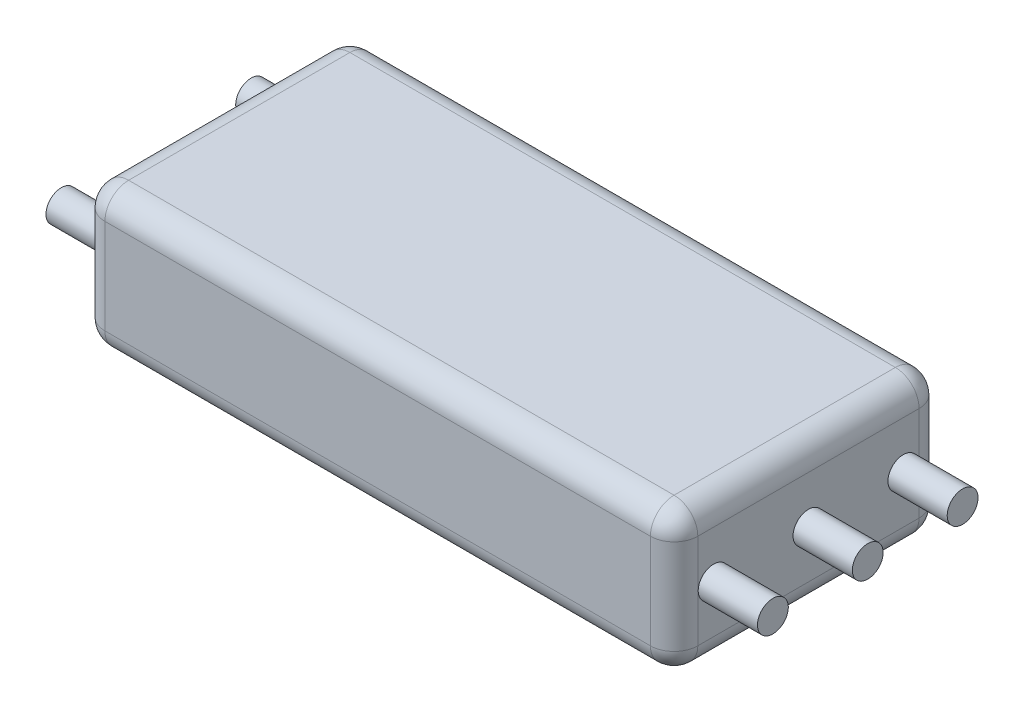
ISO-10303-21;
HEADER;
FILE_DESCRIPTION(('STEP AP214'),'2;1');
FILE_NAME('part.step','',(''),(''),'','','');
FILE_SCHEMA(('AUTOMOTIVE_DESIGN { 1 0 10303 214 1 1 1 1 }'));
ENDSEC;
DATA;
#1=APPLICATION_CONTEXT('core data for automotive mechanical design processes');
#2=APPLICATION_PROTOCOL_DEFINITION('international standard','automotive_design',2000,#1);
#3=PRODUCT_CONTEXT('',#1,'mechanical');
#4=PRODUCT('Part','Part','',(#3));
#5=PRODUCT_RELATED_PRODUCT_CATEGORY('part','',(#4));
#6=PRODUCT_DEFINITION_FORMATION('','',#4);
#7=PRODUCT_DEFINITION_CONTEXT('part definition',#1,'design');
#8=PRODUCT_DEFINITION('design','',#6,#7);
#9=PRODUCT_DEFINITION_SHAPE('','',#8);
#10=(LENGTH_UNIT() NAMED_UNIT(*) SI_UNIT(.MILLI.,.METRE.));
#11=(NAMED_UNIT(*) PLANE_ANGLE_UNIT() SI_UNIT($,.RADIAN.));
#12=(NAMED_UNIT(*) SI_UNIT($,.STERADIAN.) SOLID_ANGLE_UNIT());
#13=UNCERTAINTY_MEASURE_WITH_UNIT(LENGTH_MEASURE(1.E-05),#10,'distance_accuracy_value','');
#14=(GEOMETRIC_REPRESENTATION_CONTEXT(3) GLOBAL_UNCERTAINTY_ASSIGNED_CONTEXT((#13)) GLOBAL_UNIT_ASSIGNED_CONTEXT((#10,
#11,#12)) REPRESENTATION_CONTEXT('',''));
#15=CARTESIAN_POINT('',(0.,0.,0.));
#16=DIRECTION('',(0.,0.,1.));
#17=DIRECTION('',(1.,0.,0.));
#18=AXIS2_PLACEMENT_3D('',#15,#16,#17);
#19=CARTESIAN_POINT('',(31.75,7.62,14.3891));
#20=DIRECTION('',(-1.,0.,0.));
#21=DIRECTION('',(0.,0.,1.));
#22=AXIS2_PLACEMENT_3D('',#19,#20,#21);
#23=PLANE('',#22);
#24=CARTESIAN_POINT('',(31.75,0.,10.16));
#25=DIRECTION('',(-1.,0.,0.));
#26=DIRECTION('',(0.,0.,1.));
#27=AXIS2_PLACEMENT_3D('',#24,#25,#26);
#28=CIRCLE('',#27,1.651);
#29=CARTESIAN_POINT('',(31.75,0.,11.811));
#30=VERTEX_POINT('',#29);
#31=EDGE_CURVE('E805',#30,#30,#28,.T.);
#32=ORIENTED_EDGE('',*,*,#31,.T.);
#33=EDGE_LOOP('',(#32));
#34=FACE_BOUND('',#33,.T.);
#35=CARTESIAN_POINT('',(31.75,0.,-10.16));
#36=DIRECTION('',(-1.,0.,0.));
#37=DIRECTION('',(0.,0.,1.));
#38=AXIS2_PLACEMENT_3D('',#35,#36,#37);
#39=CIRCLE('',#38,1.651);
#40=CARTESIAN_POINT('',(31.75,0.,-8.509));
#41=VERTEX_POINT('',#40);
#42=EDGE_CURVE('E810',#41,#41,#39,.T.);
#43=ORIENTED_EDGE('',*,*,#42,.T.);
#44=EDGE_LOOP('',(#43));
#45=FACE_BOUND('',#44,.T.);
#46=CARTESIAN_POINT('',(31.75,0.,0.));
#47=DIRECTION('',(-1.,0.,0.));
#48=DIRECTION('',(0.,0.,1.));
#49=AXIS2_PLACEMENT_3D('',#46,#47,#48);
#50=CIRCLE('',#49,1.651);
#51=CARTESIAN_POINT('',(31.75,0.,1.651));
#52=VERTEX_POINT('',#51);
#53=EDGE_CURVE('E813',#52,#52,#50,.T.);
#54=ORIENTED_EDGE('',*,*,#53,.T.);
#55=EDGE_LOOP('',(#54));
#56=FACE_BOUND('',#55,.T.);
#57=DIRECTION('',(0.,-1.,0.));
#58=VECTOR('',#57,1.);
#59=CARTESIAN_POINT('',(31.75,7.62,-11.8491));
#60=LINE('',#59,#58);
#61=CARTESIAN_POINT('',(31.75,-5.08,-11.8491));
#62=VERTEX_POINT('',#61);
#63=CARTESIAN_POINT('',(31.75,5.08,-11.8491));
#64=VERTEX_POINT('',#63);
#65=EDGE_CURVE('E138',#62,#64,#60,.F.);
#66=ORIENTED_EDGE('',*,*,#65,.T.);
#67=DIRECTION('',(0.,0.,-1.));
#68=VECTOR('',#67,1.);
#69=CARTESIAN_POINT('',(31.75,5.08,14.3891));
#70=LINE('',#69,#68);
#71=CARTESIAN_POINT('',(31.75,5.08,11.8491));
#72=VERTEX_POINT('',#71);
#73=EDGE_CURVE('E176',#64,#72,#70,.F.);
#74=ORIENTED_EDGE('',*,*,#73,.T.);
#75=DIRECTION('',(0.,-1.,0.));
#76=VECTOR('',#75,1.);
#77=CARTESIAN_POINT('',(31.75,7.62,11.8491));
#78=LINE('',#77,#76);
#79=CARTESIAN_POINT('',(31.75,-5.08,11.8491));
#80=VERTEX_POINT('',#79);
#81=EDGE_CURVE('E173',#72,#80,#78,.T.);
#82=ORIENTED_EDGE('',*,*,#81,.T.);
#83=DIRECTION('',(0.,0.,-1.));
#84=VECTOR('',#83,1.);
#85=CARTESIAN_POINT('',(31.75,-5.08,-14.3891));
#86=LINE('',#85,#84);
#87=EDGE_CURVE('E168',#80,#62,#86,.T.);
#88=ORIENTED_EDGE('',*,*,#87,.T.);
#89=EDGE_LOOP('',(#66,#74,#82,#88));
#90=FACE_BOUND('',#89,.T.);
#91=ADVANCED_FACE('F42',(#34,#45,#56,#90),#23,.F.);
#92=CARTESIAN_POINT('',(-31.75,7.62,-14.3891));
#93=DIRECTION('',(0.,0.,1.));
#94=DIRECTION('',(1.,0.,0.));
#95=AXIS2_PLACEMENT_3D('',#92,#93,#94);
#96=PLANE('',#95);
#97=DIRECTION('',(0.,-1.,0.));
#98=VECTOR('',#97,1.);
#99=CARTESIAN_POINT('',(-29.21,7.62,-14.3891));
#100=LINE('',#99,#98);
#101=CARTESIAN_POINT('',(-29.21,-5.08,-14.3891));
#102=VERTEX_POINT('',#101);
#103=CARTESIAN_POINT('',(-29.21,5.08,-14.3891));
#104=VERTEX_POINT('',#103);
#105=EDGE_CURVE('E161',#102,#104,#100,.F.);
#106=ORIENTED_EDGE('',*,*,#105,.T.);
#107=DIRECTION('',(-1.,0.,0.));
#108=VECTOR('',#107,1.);
#109=CARTESIAN_POINT('',(-31.75,5.08,-14.3891));
#110=LINE('',#109,#108);
#111=CARTESIAN_POINT('',(29.21,5.08,-14.3891));
#112=VERTEX_POINT('',#111);
#113=EDGE_CURVE('E165',#104,#112,#110,.F.);
#114=ORIENTED_EDGE('',*,*,#113,.T.);
#115=DIRECTION('',(0.,-1.,0.));
#116=VECTOR('',#115,1.);
#117=CARTESIAN_POINT('',(29.21,7.62,-14.3891));
#118=LINE('',#117,#116);
#119=CARTESIAN_POINT('',(29.21,-5.08,-14.3891));
#120=VERTEX_POINT('',#119);
#121=EDGE_CURVE('E136',#112,#120,#118,.T.);
#122=ORIENTED_EDGE('',*,*,#121,.T.);
#123=DIRECTION('',(-1.,0.,0.));
#124=VECTOR('',#123,1.);
#125=CARTESIAN_POINT('',(-31.75,-5.08,-14.3891));
#126=LINE('',#125,#124);
#127=EDGE_CURVE('E155',#120,#102,#126,.T.);
#128=ORIENTED_EDGE('',*,*,#127,.T.);
#129=EDGE_LOOP('',(#106,#114,#122,#128));
#130=FACE_BOUND('',#129,.T.);
#131=ADVANCED_FACE('F163',(#130),#96,.F.);
#132=CARTESIAN_POINT('',(-31.75,7.62,14.3891));
#133=DIRECTION('',(1.,0.,0.));
#134=DIRECTION('',(0.,0.,-1.));
#135=AXIS2_PLACEMENT_3D('',#132,#133,#134);
#136=PLANE('',#135);
#137=CARTESIAN_POINT('',(-31.75,0.,10.16));
#138=DIRECTION('',(1.,0.,0.));
#139=DIRECTION('',(0.,0.,-1.));
#140=AXIS2_PLACEMENT_3D('',#137,#138,#139);
#141=CIRCLE('',#140,1.651);
#142=CARTESIAN_POINT('',(-31.75,0.,8.509));
#143=VERTEX_POINT('',#142);
#144=EDGE_CURVE('E791',#143,#143,#141,.T.);
#145=ORIENTED_EDGE('',*,*,#144,.T.);
#146=EDGE_LOOP('',(#145));
#147=FACE_BOUND('',#146,.T.);
#148=CARTESIAN_POINT('',(-31.75,0.,-10.16));
#149=DIRECTION('',(1.,0.,0.));
#150=DIRECTION('',(0.,0.,-1.));
#151=AXIS2_PLACEMENT_3D('',#148,#149,#150);
#152=CIRCLE('',#151,1.651);
#153=CARTESIAN_POINT('',(-31.75,0.,-11.811));
#154=VERTEX_POINT('',#153);
#155=EDGE_CURVE('E794',#154,#154,#152,.T.);
#156=ORIENTED_EDGE('',*,*,#155,.T.);
#157=EDGE_LOOP('',(#156));
#158=FACE_BOUND('',#157,.T.);
#159=DIRECTION('',(0.,-1.,0.));
#160=VECTOR('',#159,1.);
#161=CARTESIAN_POINT('',(-31.75,7.62,11.8491));
#162=LINE('',#161,#160);
#163=CARTESIAN_POINT('',(-31.75,-5.08,11.8491));
#164=VERTEX_POINT('',#163);
#165=CARTESIAN_POINT('',(-31.75,5.08,11.8491));
#166=VERTEX_POINT('',#165);
#167=EDGE_CURVE('E180',#164,#166,#162,.F.);
#168=ORIENTED_EDGE('',*,*,#167,.T.);
#169=DIRECTION('',(0.,0.,1.));
#170=VECTOR('',#169,1.);
#171=CARTESIAN_POINT('',(-31.75,5.08,14.3891));
#172=LINE('',#171,#170);
#173=CARTESIAN_POINT('',(-31.75,5.08,-11.8491));
#174=VERTEX_POINT('',#173);
#175=EDGE_CURVE('E185',#166,#174,#172,.F.);
#176=ORIENTED_EDGE('',*,*,#175,.T.);
#177=DIRECTION('',(0.,-1.,0.));
#178=VECTOR('',#177,1.);
#179=CARTESIAN_POINT('',(-31.75,7.62,-11.8491));
#180=LINE('',#179,#178);
#181=CARTESIAN_POINT('',(-31.75,-5.08,-11.8491));
#182=VERTEX_POINT('',#181);
#183=EDGE_CURVE('E182',#174,#182,#180,.T.);
#184=ORIENTED_EDGE('',*,*,#183,.T.);
#185=DIRECTION('',(0.,0.,1.));
#186=VECTOR('',#185,1.);
#187=CARTESIAN_POINT('',(-31.75,-5.08,14.3891));
#188=LINE('',#187,#186);
#189=EDGE_CURVE('E178',#182,#164,#188,.T.);
#190=ORIENTED_EDGE('',*,*,#189,.T.);
#191=EDGE_LOOP('',(#168,#176,#184,#190));
#192=FACE_BOUND('',#191,.T.);
#193=ADVANCED_FACE('F290',(#147,#158,#192),#136,.F.);
#194=CARTESIAN_POINT('',(-31.75,7.62,14.3891));
#195=DIRECTION('',(0.,0.,-1.));
#196=DIRECTION('',(-1.,0.,0.));
#197=AXIS2_PLACEMENT_3D('',#194,#195,#196);
#198=PLANE('',#197);
#199=DIRECTION('',(0.,-1.,0.));
#200=VECTOR('',#199,1.);
#201=CARTESIAN_POINT('',(29.21,7.62,14.3891));
#202=LINE('',#201,#200);
#203=CARTESIAN_POINT('',(29.21,-5.08,14.3891));
#204=VERTEX_POINT('',#203);
#205=CARTESIAN_POINT('',(29.21,5.08,14.3891));
#206=VERTEX_POINT('',#205);
#207=EDGE_CURVE('E189',#204,#206,#202,.F.);
#208=ORIENTED_EDGE('',*,*,#207,.T.);
#209=DIRECTION('',(1.,0.,0.));
#210=VECTOR('',#209,1.);
#211=CARTESIAN_POINT('',(-31.75,5.08,14.3891));
#212=LINE('',#211,#210);
#213=CARTESIAN_POINT('',(-29.21,5.08,14.3891));
#214=VERTEX_POINT('',#213);
#215=EDGE_CURVE('E194',#206,#214,#212,.F.);
#216=ORIENTED_EDGE('',*,*,#215,.T.);
#217=DIRECTION('',(0.,-1.,0.));
#218=VECTOR('',#217,1.);
#219=CARTESIAN_POINT('',(-29.21,7.62,14.3891));
#220=LINE('',#219,#218);
#221=CARTESIAN_POINT('',(-29.21,-5.08,14.3891));
#222=VERTEX_POINT('',#221);
#223=EDGE_CURVE('E191',#214,#222,#220,.T.);
#224=ORIENTED_EDGE('',*,*,#223,.T.);
#225=DIRECTION('',(1.,0.,0.));
#226=VECTOR('',#225,1.);
#227=CARTESIAN_POINT('',(31.75,-5.08,14.3891));
#228=LINE('',#227,#226);
#229=EDGE_CURVE('E187',#222,#204,#228,.T.);
#230=ORIENTED_EDGE('',*,*,#229,.T.);
#231=EDGE_LOOP('',(#208,#216,#224,#230));
#232=FACE_BOUND('',#231,.T.);
#233=ADVANCED_FACE('F301',(#232),#198,.F.);
#234=CARTESIAN_POINT('',(0.,7.62,0.));
#235=DIRECTION('',(0.,-1.,0.));
#236=DIRECTION('',(0.,0.,-1.));
#237=AXIS2_PLACEMENT_3D('',#234,#235,#236);
#238=PLANE('',#237);
#239=DIRECTION('',(0.,0.,1.));
#240=VECTOR('',#239,1.);
#241=CARTESIAN_POINT('',(-29.21,7.62,0.));
#242=LINE('',#241,#240);
#243=CARTESIAN_POINT('',(-29.21,7.62,-11.8491));
#244=VERTEX_POINT('',#243);
#245=CARTESIAN_POINT('',(-29.21,7.62,11.8491));
#246=VERTEX_POINT('',#245);
#247=EDGE_CURVE('E200',#244,#246,#242,.T.);
#248=ORIENTED_EDGE('',*,*,#247,.T.);
#249=DIRECTION('',(1.,0.,0.));
#250=VECTOR('',#249,1.);
#251=CARTESIAN_POINT('',(0.,7.62,11.8491));
#252=LINE('',#251,#250);
#253=CARTESIAN_POINT('',(29.21,7.62,11.8491));
#254=VERTEX_POINT('',#253);
#255=EDGE_CURVE('E202',#246,#254,#252,.T.);
#256=ORIENTED_EDGE('',*,*,#255,.T.);
#257=DIRECTION('',(0.,0.,-1.));
#258=VECTOR('',#257,1.);
#259=CARTESIAN_POINT('',(29.21,7.62,0.));
#260=LINE('',#259,#258);
#261=CARTESIAN_POINT('',(29.21,7.62,-11.8491));
#262=VERTEX_POINT('',#261);
#263=EDGE_CURVE('E196',#254,#262,#260,.T.);
#264=ORIENTED_EDGE('',*,*,#263,.T.);
#265=DIRECTION('',(-1.,0.,0.));
#266=VECTOR('',#265,1.);
#267=CARTESIAN_POINT('',(0.,7.62,-11.8491));
#268=LINE('',#267,#266);
#269=EDGE_CURVE('E198',#262,#244,#268,.T.);
#270=ORIENTED_EDGE('',*,*,#269,.T.);
#271=EDGE_LOOP('',(#248,#256,#264,#270));
#272=FACE_BOUND('',#271,.T.);
#273=ADVANCED_FACE('F282',(#272),#238,.F.);
#274=CARTESIAN_POINT('',(0.,-7.62,0.));
#275=DIRECTION('',(0.,-1.,0.));
#276=DIRECTION('',(0.,0.,-1.));
#277=AXIS2_PLACEMENT_3D('',#274,#275,#276);
#278=PLANE('',#277);
#279=DIRECTION('',(0.,0.,1.));
#280=VECTOR('',#279,1.);
#281=CARTESIAN_POINT('',(-29.21,-7.62,-14.3891));
#282=LINE('',#281,#280);
#283=CARTESIAN_POINT('',(-29.21,-7.62,11.8491));
#284=VERTEX_POINT('',#283);
#285=CARTESIAN_POINT('',(-29.21,-7.62,-11.8491));
#286=VERTEX_POINT('',#285);
#287=EDGE_CURVE('E51',#284,#286,#282,.F.);
#288=ORIENTED_EDGE('',*,*,#287,.T.);
#289=DIRECTION('',(-1.,0.,0.));
#290=VECTOR('',#289,1.);
#291=CARTESIAN_POINT('',(31.75,-7.62,-11.8491));
#292=LINE('',#291,#290);
#293=CARTESIAN_POINT('',(29.21,-7.62,-11.8491));
#294=VERTEX_POINT('',#293);
#295=EDGE_CURVE('E11',#286,#294,#292,.F.);
#296=ORIENTED_EDGE('',*,*,#295,.T.);
#297=DIRECTION('',(0.,0.,-1.));
#298=VECTOR('',#297,1.);
#299=CARTESIAN_POINT('',(29.21,-7.62,14.3891));
#300=LINE('',#299,#298);
#301=CARTESIAN_POINT('',(29.21,-7.62,11.8491));
#302=VERTEX_POINT('',#301);
#303=EDGE_CURVE('E205',#294,#302,#300,.F.);
#304=ORIENTED_EDGE('',*,*,#303,.T.);
#305=DIRECTION('',(1.,0.,0.));
#306=VECTOR('',#305,1.);
#307=CARTESIAN_POINT('',(-31.75,-7.62,11.8491));
#308=LINE('',#307,#306);
#309=EDGE_CURVE('E62',#302,#284,#308,.F.);
#310=ORIENTED_EDGE('',*,*,#309,.T.);
#311=EDGE_LOOP('',(#288,#296,#304,#310));
#312=FACE_BOUND('',#311,.T.);
#313=ADVANCED_FACE('F695',(#312),#278,.T.);
#314=CARTESIAN_POINT('',(-29.21,7.62,11.8491));
#315=DIRECTION('',(0.,-1.,0.));
#316=DIRECTION('',(0.,0.,-1.));
#317=AXIS2_PLACEMENT_3D('',#314,#315,#316);
#318=CYLINDRICAL_SURFACE('',#317,2.54);
#319=CARTESIAN_POINT('',(-29.21,5.08,11.8491));
#320=DIRECTION('',(0.,1.,0.));
#321=DIRECTION('',(0.,0.,1.));
#322=AXIS2_PLACEMENT_3D('',#319,#320,#321);
#323=CIRCLE('',#322,2.54);
#324=EDGE_CURVE('E46',#166,#214,#323,.T.);
#325=ORIENTED_EDGE('',*,*,#324,.F.);
#326=ORIENTED_EDGE('',*,*,#167,.F.);
#327=CARTESIAN_POINT('',(-29.21,-5.08,11.8491));
#328=DIRECTION('',(0.,-1.,0.));
#329=DIRECTION('',(0.,0.,-1.));
#330=AXIS2_PLACEMENT_3D('',#327,#328,#329);
#331=CIRCLE('',#330,2.54);
#332=EDGE_CURVE('E259',#222,#164,#331,.T.);
#333=ORIENTED_EDGE('',*,*,#332,.F.);
#334=ORIENTED_EDGE('',*,*,#223,.F.);
#335=EDGE_LOOP('',(#325,#326,#333,#334));
#336=FACE_BOUND('',#335,.T.);
#337=ADVANCED_FACE('F44',(#336),#318,.T.);
#338=CARTESIAN_POINT('',(-29.21,5.08,11.8491));
#339=DIRECTION('',(0.,0.,1.));
#340=DIRECTION('',(1.,0.,0.));
#341=AXIS2_PLACEMENT_3D('',#338,#339,#340);
#342=SPHERICAL_SURFACE('',#341,2.54);
#343=CARTESIAN_POINT('',(-29.21,5.08,11.8491));
#344=DIRECTION('',(0.,0.,1.));
#345=DIRECTION('',(1.,0.,0.));
#346=AXIS2_PLACEMENT_3D('',#343,#344,#345);
#347=CIRCLE('',#346,2.54);
#348=EDGE_CURVE('E254',#166,#246,#347,.F.);
#349=ORIENTED_EDGE('',*,*,#348,.F.);
#350=ORIENTED_EDGE('',*,*,#324,.T.);
#351=CARTESIAN_POINT('',(-29.21,5.08,11.8491));
#352=DIRECTION('',(-1.,0.,0.));
#353=DIRECTION('',(0.,0.,1.));
#354=AXIS2_PLACEMENT_3D('',#351,#352,#353);
#355=CIRCLE('',#354,2.54);
#356=EDGE_CURVE('E257',#246,#214,#355,.F.);
#357=ORIENTED_EDGE('',*,*,#356,.F.);
#358=EDGE_LOOP('',(#349,#350,#357));
#359=FACE_BOUND('',#358,.T.);
#360=ADVANCED_FACE('F270',(#359),#342,.T.);
#361=CARTESIAN_POINT('',(-29.21,-5.08,11.8491));
#362=DIRECTION('',(-1.,0.,0.));
#363=DIRECTION('',(0.,-1.,0.));
#364=AXIS2_PLACEMENT_3D('',#361,#362,#363);
#365=SPHERICAL_SURFACE('',#364,2.54);
#366=CARTESIAN_POINT('',(-29.21,-5.08,11.8491));
#367=DIRECTION('',(-1.,0.,0.));
#368=DIRECTION('',(0.,0.,1.));
#369=AXIS2_PLACEMENT_3D('',#366,#367,#368);
#370=CIRCLE('',#369,2.54);
#371=EDGE_CURVE('E249',#222,#284,#370,.F.);
#372=ORIENTED_EDGE('',*,*,#371,.F.);
#373=ORIENTED_EDGE('',*,*,#332,.T.);
#374=CARTESIAN_POINT('',(-29.21,-5.08,11.8491));
#375=DIRECTION('',(0.,0.,1.));
#376=DIRECTION('',(1.,0.,0.));
#377=AXIS2_PLACEMENT_3D('',#374,#375,#376);
#378=CIRCLE('',#377,2.54);
#379=EDGE_CURVE('E251',#284,#164,#378,.F.);
#380=ORIENTED_EDGE('',*,*,#379,.F.);
#381=EDGE_LOOP('',(#372,#373,#380));
#382=FACE_BOUND('',#381,.T.);
#383=ADVANCED_FACE('F665',(#382),#365,.T.);
#384=CARTESIAN_POINT('',(0.,5.08,11.8491));
#385=DIRECTION('',(1.,0.,0.));
#386=DIRECTION('',(0.,0.,-1.));
#387=AXIS2_PLACEMENT_3D('',#384,#385,#386);
#388=CYLINDRICAL_SURFACE('',#387,2.54);
#389=ORIENTED_EDGE('',*,*,#356,.T.);
#390=ORIENTED_EDGE('',*,*,#215,.F.);
#391=CARTESIAN_POINT('',(29.21,5.08,11.8491));
#392=DIRECTION('',(1.,0.,0.));
#393=DIRECTION('',(0.,0.,-1.));
#394=AXIS2_PLACEMENT_3D('',#391,#392,#393);
#395=CIRCLE('',#394,2.54);
#396=EDGE_CURVE('E243',#254,#206,#395,.T.);
#397=ORIENTED_EDGE('',*,*,#396,.F.);
#398=ORIENTED_EDGE('',*,*,#255,.F.);
#399=EDGE_LOOP('',(#389,#390,#397,#398));
#400=FACE_BOUND('',#399,.T.);
#401=ADVANCED_FACE('F278',(#400),#388,.T.);
#402=CARTESIAN_POINT('',(-29.21,5.08,0.));
#403=DIRECTION('',(0.,0.,1.));
#404=DIRECTION('',(1.,0.,0.));
#405=AXIS2_PLACEMENT_3D('',#402,#403,#404);
#406=CYLINDRICAL_SURFACE('',#405,2.54);
#407=ORIENTED_EDGE('',*,*,#348,.T.);
#408=ORIENTED_EDGE('',*,*,#247,.F.);
#409=CARTESIAN_POINT('',(-29.21,5.08,-11.8491));
#410=DIRECTION('',(0.,0.,-1.));
#411=DIRECTION('',(-1.,0.,0.));
#412=AXIS2_PLACEMENT_3D('',#409,#410,#411);
#413=CIRCLE('',#412,2.54);
#414=EDGE_CURVE('E240',#174,#244,#413,.T.);
#415=ORIENTED_EDGE('',*,*,#414,.F.);
#416=ORIENTED_EDGE('',*,*,#175,.F.);
#417=EDGE_LOOP('',(#407,#408,#415,#416));
#418=FACE_BOUND('',#417,.T.);
#419=ADVANCED_FACE('F287',(#418),#406,.T.);
#420=CARTESIAN_POINT('',(-29.21,7.62,-11.8491));
#421=DIRECTION('',(0.,-1.,0.));
#422=DIRECTION('',(0.,0.,-1.));
#423=AXIS2_PLACEMENT_3D('',#420,#421,#422);
#424=CYLINDRICAL_SURFACE('',#423,2.54);
#425=CARTESIAN_POINT('',(-29.21,-5.08,-11.8491));
#426=DIRECTION('',(0.,-1.,0.));
#427=DIRECTION('',(0.,0.,-1.));
#428=AXIS2_PLACEMENT_3D('',#425,#426,#427);
#429=CIRCLE('',#428,2.54);
#430=EDGE_CURVE('E234',#182,#102,#429,.T.);
#431=ORIENTED_EDGE('',*,*,#430,.F.);
#432=ORIENTED_EDGE('',*,*,#183,.F.);
#433=CARTESIAN_POINT('',(-29.21,5.08,-11.8491));
#434=DIRECTION('',(0.,1.,0.));
#435=DIRECTION('',(0.,0.,1.));
#436=AXIS2_PLACEMENT_3D('',#433,#434,#435);
#437=CIRCLE('',#436,2.54);
#438=EDGE_CURVE('E237',#104,#174,#437,.T.);
#439=ORIENTED_EDGE('',*,*,#438,.F.);
#440=ORIENTED_EDGE('',*,*,#105,.F.);
#441=EDGE_LOOP('',(#431,#432,#439,#440));
#442=FACE_BOUND('',#441,.T.);
#443=ADVANCED_FACE('F294',(#442),#424,.T.);
#444=CARTESIAN_POINT('',(-29.21,-5.08,14.3891));
#445=DIRECTION('',(0.,0.,-1.));
#446=DIRECTION('',(-1.,0.,0.));
#447=AXIS2_PLACEMENT_3D('',#444,#445,#446);
#448=CYLINDRICAL_SURFACE('',#447,2.54);
#449=ORIENTED_EDGE('',*,*,#379,.T.);
#450=ORIENTED_EDGE('',*,*,#189,.F.);
#451=CARTESIAN_POINT('',(-29.21,-5.08,-11.8491));
#452=DIRECTION('',(0.,0.,-1.));
#453=DIRECTION('',(-1.,0.,0.));
#454=AXIS2_PLACEMENT_3D('',#451,#452,#453);
#455=CIRCLE('',#454,2.54);
#456=EDGE_CURVE('E232',#286,#182,#455,.T.);
#457=ORIENTED_EDGE('',*,*,#456,.F.);
#458=ORIENTED_EDGE('',*,*,#287,.F.);
#459=EDGE_LOOP('',(#449,#450,#457,#458));
#460=FACE_BOUND('',#459,.T.);
#461=ADVANCED_FACE('F299',(#460),#448,.T.);
#462=CARTESIAN_POINT('',(-31.75,-5.08,11.8491));
#463=DIRECTION('',(-1.,0.,0.));
#464=DIRECTION('',(0.,0.,1.));
#465=AXIS2_PLACEMENT_3D('',#462,#463,#464);
#466=CYLINDRICAL_SURFACE('',#465,2.54);
#467=ORIENTED_EDGE('',*,*,#371,.T.);
#468=ORIENTED_EDGE('',*,*,#309,.F.);
#469=CARTESIAN_POINT('',(29.21,-5.08,11.8491));
#470=DIRECTION('',(1.,0.,0.));
#471=DIRECTION('',(0.,0.,-1.));
#472=AXIS2_PLACEMENT_3D('',#469,#470,#471);
#473=CIRCLE('',#472,2.54);
#474=EDGE_CURVE('E229',#204,#302,#473,.T.);
#475=ORIENTED_EDGE('',*,*,#474,.F.);
#476=ORIENTED_EDGE('',*,*,#229,.F.);
#477=EDGE_LOOP('',(#467,#468,#475,#476));
#478=FACE_BOUND('',#477,.T.);
#479=ADVANCED_FACE('F310',(#478),#466,.T.);
#480=CARTESIAN_POINT('',(29.21,7.62,11.8491));
#481=DIRECTION('',(0.,-1.,0.));
#482=DIRECTION('',(0.,0.,-1.));
#483=AXIS2_PLACEMENT_3D('',#480,#481,#482);
#484=CYLINDRICAL_SURFACE('',#483,2.54);
#485=CARTESIAN_POINT('',(29.21,5.08,11.8491));
#486=DIRECTION('',(0.,1.,0.));
#487=DIRECTION('',(0.,0.,1.));
#488=AXIS2_PLACEMENT_3D('',#485,#486,#487);
#489=CIRCLE('',#488,2.54);
#490=EDGE_CURVE('E246',#206,#72,#489,.T.);
#491=ORIENTED_EDGE('',*,*,#490,.F.);
#492=ORIENTED_EDGE('',*,*,#207,.F.);
#493=CARTESIAN_POINT('',(29.21,-5.08,11.8491));
#494=DIRECTION('',(0.,-1.,0.));
#495=DIRECTION('',(0.,0.,-1.));
#496=AXIS2_PLACEMENT_3D('',#493,#494,#495);
#497=CIRCLE('',#496,2.54);
#498=EDGE_CURVE('E226',#80,#204,#497,.T.);
#499=ORIENTED_EDGE('',*,*,#498,.F.);
#500=ORIENTED_EDGE('',*,*,#81,.F.);
#501=EDGE_LOOP('',(#491,#492,#499,#500));
#502=FACE_BOUND('',#501,.T.);
#503=ADVANCED_FACE('F306',(#502),#484,.T.);
#504=CARTESIAN_POINT('',(29.21,5.08,11.8491));
#505=DIRECTION('',(0.,0.,1.));
#506=DIRECTION('',(1.,0.,0.));
#507=AXIS2_PLACEMENT_3D('',#504,#505,#506);
#508=SPHERICAL_SURFACE('',#507,2.54);
#509=ORIENTED_EDGE('',*,*,#396,.T.);
#510=ORIENTED_EDGE('',*,*,#490,.T.);
#511=CARTESIAN_POINT('',(29.21,5.08,11.8491));
#512=DIRECTION('',(0.,0.,1.));
#513=DIRECTION('',(1.,0.,0.));
#514=AXIS2_PLACEMENT_3D('',#511,#512,#513);
#515=CIRCLE('',#514,2.54);
#516=EDGE_CURVE('E223',#254,#72,#515,.F.);
#517=ORIENTED_EDGE('',*,*,#516,.F.);
#518=EDGE_LOOP('',(#509,#510,#517));
#519=FACE_BOUND('',#518,.T.);
#520=ADVANCED_FACE('F320',(#519),#508,.T.);
#521=CARTESIAN_POINT('',(-29.21,5.08,-11.8491));
#522=DIRECTION('',(-1.,0.,0.));
#523=DIRECTION('',(0.,0.,1.));
#524=AXIS2_PLACEMENT_3D('',#521,#522,#523);
#525=SPHERICAL_SURFACE('',#524,2.54);
#526=ORIENTED_EDGE('',*,*,#438,.T.);
#527=ORIENTED_EDGE('',*,*,#414,.T.);
#528=CARTESIAN_POINT('',(-29.21,5.08,-11.8491));
#529=DIRECTION('',(-1.,0.,0.));
#530=DIRECTION('',(0.,0.,1.));
#531=AXIS2_PLACEMENT_3D('',#528,#529,#530);
#532=CIRCLE('',#531,2.54);
#533=EDGE_CURVE('E220',#104,#244,#532,.F.);
#534=ORIENTED_EDGE('',*,*,#533,.F.);
#535=EDGE_LOOP('',(#526,#527,#534));
#536=FACE_BOUND('',#535,.T.);
#537=ADVANCED_FACE('F330',(#536),#525,.T.);
#538=CARTESIAN_POINT('',(-29.21,-5.08,-11.8491));
#539=DIRECTION('',(-1.,0.,0.));
#540=DIRECTION('',(0.,-1.,0.));
#541=AXIS2_PLACEMENT_3D('',#538,#539,#540);
#542=SPHERICAL_SURFACE('',#541,2.54);
#543=ORIENTED_EDGE('',*,*,#456,.T.);
#544=ORIENTED_EDGE('',*,*,#430,.T.);
#545=CARTESIAN_POINT('',(-29.21,-5.08,-11.8491));
#546=DIRECTION('',(-1.,0.,0.));
#547=DIRECTION('',(0.,0.,1.));
#548=AXIS2_PLACEMENT_3D('',#545,#546,#547);
#549=CIRCLE('',#548,2.54);
#550=EDGE_CURVE('E158',#286,#102,#549,.F.);
#551=ORIENTED_EDGE('',*,*,#550,.F.);
#552=EDGE_LOOP('',(#543,#544,#551));
#553=FACE_BOUND('',#552,.T.);
#554=ADVANCED_FACE('F332',(#553),#542,.T.);
#555=CARTESIAN_POINT('',(29.21,-5.08,11.8491));
#556=DIRECTION('',(0.,0.,1.));
#557=DIRECTION('',(0.,-1.,0.));
#558=AXIS2_PLACEMENT_3D('',#555,#556,#557);
#559=SPHERICAL_SURFACE('',#558,2.54);
#560=ORIENTED_EDGE('',*,*,#498,.T.);
#561=ORIENTED_EDGE('',*,*,#474,.T.);
#562=CARTESIAN_POINT('',(29.21,-5.08,11.8491));
#563=DIRECTION('',(0.,0.,1.));
#564=DIRECTION('',(1.,0.,0.));
#565=AXIS2_PLACEMENT_3D('',#562,#563,#564);
#566=CIRCLE('',#565,2.54);
#567=EDGE_CURVE('E216',#80,#302,#566,.F.);
#568=ORIENTED_EDGE('',*,*,#567,.F.);
#569=EDGE_LOOP('',(#560,#561,#568));
#570=FACE_BOUND('',#569,.T.);
#571=ADVANCED_FACE('F312',(#570),#559,.T.);
#572=CARTESIAN_POINT('',(29.21,5.08,0.));
#573=DIRECTION('',(0.,0.,-1.));
#574=DIRECTION('',(-1.,0.,0.));
#575=AXIS2_PLACEMENT_3D('',#572,#573,#574);
#576=CYLINDRICAL_SURFACE('',#575,2.54);
#577=ORIENTED_EDGE('',*,*,#516,.T.);
#578=ORIENTED_EDGE('',*,*,#73,.F.);
#579=CARTESIAN_POINT('',(29.21,5.08,-11.8491));
#580=DIRECTION('',(0.,0.,-1.));
#581=DIRECTION('',(-1.,0.,0.));
#582=AXIS2_PLACEMENT_3D('',#579,#580,#581);
#583=CIRCLE('',#582,2.54);
#584=EDGE_CURVE('E213',#262,#64,#583,.T.);
#585=ORIENTED_EDGE('',*,*,#584,.F.);
#586=ORIENTED_EDGE('',*,*,#263,.F.);
#587=EDGE_LOOP('',(#577,#578,#585,#586));
#588=FACE_BOUND('',#587,.T.);
#589=ADVANCED_FACE('F322',(#588),#576,.T.);
#590=CARTESIAN_POINT('',(0.,5.08,-11.8491));
#591=DIRECTION('',(-1.,0.,0.));
#592=DIRECTION('',(0.,0.,1.));
#593=AXIS2_PLACEMENT_3D('',#590,#591,#592);
#594=CYLINDRICAL_SURFACE('',#593,2.54);
#595=ORIENTED_EDGE('',*,*,#533,.T.);
#596=ORIENTED_EDGE('',*,*,#269,.F.);
#597=CARTESIAN_POINT('',(29.21,5.08,-11.8491));
#598=DIRECTION('',(1.,0.,0.));
#599=DIRECTION('',(0.,0.,-1.));
#600=AXIS2_PLACEMENT_3D('',#597,#598,#599);
#601=CIRCLE('',#600,2.54);
#602=EDGE_CURVE('E152',#112,#262,#601,.T.);
#603=ORIENTED_EDGE('',*,*,#602,.F.);
#604=ORIENTED_EDGE('',*,*,#113,.F.);
#605=EDGE_LOOP('',(#595,#596,#603,#604));
#606=FACE_BOUND('',#605,.T.);
#607=ADVANCED_FACE('F328',(#606),#594,.T.);
#608=CARTESIAN_POINT('',(-31.75,-5.08,-11.8491));
#609=DIRECTION('',(1.,0.,0.));
#610=DIRECTION('',(0.,0.,-1.));
#611=AXIS2_PLACEMENT_3D('',#608,#609,#610);
#612=CYLINDRICAL_SURFACE('',#611,2.54);
#613=ORIENTED_EDGE('',*,*,#550,.T.);
#614=ORIENTED_EDGE('',*,*,#127,.F.);
#615=CARTESIAN_POINT('',(29.21,-5.08,-11.8491));
#616=DIRECTION('',(1.,0.,0.));
#617=DIRECTION('',(0.,0.,-1.));
#618=AXIS2_PLACEMENT_3D('',#615,#616,#617);
#619=CIRCLE('',#618,2.54);
#620=EDGE_CURVE('E144',#294,#120,#619,.T.);
#621=ORIENTED_EDGE('',*,*,#620,.F.);
#622=ORIENTED_EDGE('',*,*,#295,.F.);
#623=EDGE_LOOP('',(#613,#614,#621,#622));
#624=FACE_BOUND('',#623,.T.);
#625=ADVANCED_FACE('F156',(#624),#612,.T.);
#626=CARTESIAN_POINT('',(29.21,-5.08,14.3891));
#627=DIRECTION('',(0.,0.,1.));
#628=DIRECTION('',(1.,0.,0.));
#629=AXIS2_PLACEMENT_3D('',#626,#627,#628);
#630=CYLINDRICAL_SURFACE('',#629,2.54);
#631=ORIENTED_EDGE('',*,*,#567,.T.);
#632=ORIENTED_EDGE('',*,*,#303,.F.);
#633=CARTESIAN_POINT('',(29.21,-5.08,-11.8491));
#634=DIRECTION('',(0.,0.,-1.));
#635=DIRECTION('',(-1.,0.,0.));
#636=AXIS2_PLACEMENT_3D('',#633,#634,#635);
#637=CIRCLE('',#636,2.54);
#638=EDGE_CURVE('E148',#62,#294,#637,.T.);
#639=ORIENTED_EDGE('',*,*,#638,.F.);
#640=ORIENTED_EDGE('',*,*,#87,.F.);
#641=EDGE_LOOP('',(#631,#632,#639,#640));
#642=FACE_BOUND('',#641,.T.);
#643=ADVANCED_FACE('F315',(#642),#630,.T.);
#644=CARTESIAN_POINT('',(29.21,5.08,-11.8491));
#645=DIRECTION('',(0.,1.,0.));
#646=DIRECTION('',(0.,0.,1.));
#647=AXIS2_PLACEMENT_3D('',#644,#645,#646);
#648=SPHERICAL_SURFACE('',#647,2.54);
#649=ORIENTED_EDGE('',*,*,#602,.T.);
#650=ORIENTED_EDGE('',*,*,#584,.T.);
#651=CARTESIAN_POINT('',(29.21,5.08,-11.8491));
#652=DIRECTION('',(0.,1.,0.));
#653=DIRECTION('',(0.,0.,1.));
#654=AXIS2_PLACEMENT_3D('',#651,#652,#653);
#655=CIRCLE('',#654,2.54);
#656=EDGE_CURVE('E140',#112,#64,#655,.F.);
#657=ORIENTED_EDGE('',*,*,#656,.F.);
#658=EDGE_LOOP('',(#649,#650,#657));
#659=FACE_BOUND('',#658,.T.);
#660=ADVANCED_FACE('F326',(#659),#648,.T.);
#661=CARTESIAN_POINT('',(29.21,-5.08,-11.8491));
#662=DIRECTION('',(0.,-1.,0.));
#663=DIRECTION('',(0.,0.,-1.));
#664=AXIS2_PLACEMENT_3D('',#661,#662,#663);
#665=SPHERICAL_SURFACE('',#664,2.54);
#666=ORIENTED_EDGE('',*,*,#638,.T.);
#667=ORIENTED_EDGE('',*,*,#620,.T.);
#668=CARTESIAN_POINT('',(29.21,-5.08,-11.8491));
#669=DIRECTION('',(0.,-1.,0.));
#670=DIRECTION('',(0.,0.,-1.));
#671=AXIS2_PLACEMENT_3D('',#668,#669,#670);
#672=CIRCLE('',#671,2.54);
#673=EDGE_CURVE('E132',#62,#120,#672,.F.);
#674=ORIENTED_EDGE('',*,*,#673,.F.);
#675=EDGE_LOOP('',(#666,#667,#674));
#676=FACE_BOUND('',#675,.T.);
#677=ADVANCED_FACE('F146',(#676),#665,.T.);
#678=CARTESIAN_POINT('',(29.21,7.62,-11.8491));
#679=DIRECTION('',(0.,-1.,0.));
#680=DIRECTION('',(0.,0.,-1.));
#681=AXIS2_PLACEMENT_3D('',#678,#679,#680);
#682=CYLINDRICAL_SURFACE('',#681,2.54);
#683=ORIENTED_EDGE('',*,*,#656,.T.);
#684=ORIENTED_EDGE('',*,*,#65,.F.);
#685=ORIENTED_EDGE('',*,*,#673,.T.);
#686=ORIENTED_EDGE('',*,*,#121,.F.);
#687=EDGE_LOOP('',(#683,#684,#685,#686));
#688=FACE_BOUND('',#687,.T.);
#689=ADVANCED_FACE('F134',(#688),#682,.T.);
#690=CARTESIAN_POINT('',(38.1,0.,0.));
#691=DIRECTION('',(-1.,0.,0.));
#692=DIRECTION('',(0.,0.,1.));
#693=AXIS2_PLACEMENT_3D('',#690,#691,#692);
#694=CYLINDRICAL_SURFACE('',#693,1.651);
#695=CARTESIAN_POINT('',(38.1,0.,0.));
#696=DIRECTION('',(-1.,0.,0.));
#697=DIRECTION('',(0.,0.,1.));
#698=AXIS2_PLACEMENT_3D('',#695,#696,#697);
#699=CIRCLE('',#698,1.651);
#700=CARTESIAN_POINT('',(38.1,0.,1.651));
#701=VERTEX_POINT('',#700);
#702=EDGE_CURVE('E141',#701,#701,#699,.T.);
#703=ORIENTED_EDGE('',*,*,#702,.T.);
#704=EDGE_LOOP('',(#703));
#705=FACE_BOUND('',#704,.T.);
#706=ORIENTED_EDGE('',*,*,#53,.F.);
#707=EDGE_LOOP('',(#706));
#708=FACE_BOUND('',#707,.T.);
#709=ADVANCED_FACE('F355',(#705,#708),#694,.T.);
#710=CARTESIAN_POINT('',(38.1,0.,0.));
#711=DIRECTION('',(-1.,0.,0.));
#712=DIRECTION('',(0.,0.,1.));
#713=AXIS2_PLACEMENT_3D('',#710,#711,#712);
#714=PLANE('',#713);
#715=ORIENTED_EDGE('',*,*,#702,.F.);
#716=EDGE_LOOP('',(#715));
#717=FACE_BOUND('',#716,.T.);
#718=ADVANCED_FACE('F406',(#717),#714,.F.);
#719=CARTESIAN_POINT('',(38.1,0.,-10.16));
#720=DIRECTION('',(-1.,0.,0.));
#721=DIRECTION('',(0.,0.,1.));
#722=AXIS2_PLACEMENT_3D('',#719,#720,#721);
#723=CYLINDRICAL_SURFACE('',#722,1.651);
#724=CARTESIAN_POINT('',(38.1,0.,-10.16));
#725=DIRECTION('',(-1.,0.,0.));
#726=DIRECTION('',(0.,0.,1.));
#727=AXIS2_PLACEMENT_3D('',#724,#725,#726);
#728=CIRCLE('',#727,1.651);
#729=CARTESIAN_POINT('',(38.1,0.,-8.509));
#730=VERTEX_POINT('',#729);
#731=EDGE_CURVE('E807',#730,#730,#728,.T.);
#732=ORIENTED_EDGE('',*,*,#731,.T.);
#733=EDGE_LOOP('',(#732));
#734=FACE_BOUND('',#733,.T.);
#735=ORIENTED_EDGE('',*,*,#42,.F.);
#736=EDGE_LOOP('',(#735));
#737=FACE_BOUND('',#736,.T.);
#738=ADVANCED_FACE('F413',(#734,#737),#723,.T.);
#739=CARTESIAN_POINT('',(38.1,0.,-10.16));
#740=DIRECTION('',(-1.,0.,0.));
#741=DIRECTION('',(0.,0.,1.));
#742=AXIS2_PLACEMENT_3D('',#739,#740,#741);
#743=PLANE('',#742);
#744=ORIENTED_EDGE('',*,*,#731,.F.);
#745=EDGE_LOOP('',(#744));
#746=FACE_BOUND('',#745,.T.);
#747=ADVANCED_FACE('F421',(#746),#743,.F.);
#748=CARTESIAN_POINT('',(38.1,0.,10.16));
#749=DIRECTION('',(-1.,0.,0.));
#750=DIRECTION('',(0.,0.,1.));
#751=AXIS2_PLACEMENT_3D('',#748,#749,#750);
#752=CYLINDRICAL_SURFACE('',#751,1.651);
#753=CARTESIAN_POINT('',(38.1,0.,10.16));
#754=DIRECTION('',(-1.,0.,0.));
#755=DIRECTION('',(0.,0.,1.));
#756=AXIS2_PLACEMENT_3D('',#753,#754,#755);
#757=CIRCLE('',#756,1.651);
#758=CARTESIAN_POINT('',(38.1,0.,11.811));
#759=VERTEX_POINT('',#758);
#760=EDGE_CURVE('E799',#759,#759,#757,.T.);
#761=ORIENTED_EDGE('',*,*,#760,.T.);
#762=EDGE_LOOP('',(#761));
#763=FACE_BOUND('',#762,.T.);
#764=ORIENTED_EDGE('',*,*,#31,.F.);
#765=EDGE_LOOP('',(#764));
#766=FACE_BOUND('',#765,.T.);
#767=ADVANCED_FACE('F429',(#763,#766),#752,.T.);
#768=CARTESIAN_POINT('',(38.1,0.,10.16));
#769=DIRECTION('',(-1.,0.,0.));
#770=DIRECTION('',(0.,0.,1.));
#771=AXIS2_PLACEMENT_3D('',#768,#769,#770);
#772=PLANE('',#771);
#773=ORIENTED_EDGE('',*,*,#760,.F.);
#774=EDGE_LOOP('',(#773));
#775=FACE_BOUND('',#774,.T.);
#776=ADVANCED_FACE('F437',(#775),#772,.F.);
#777=CARTESIAN_POINT('',(-38.1,0.,-10.16));
#778=DIRECTION('',(1.,0.,0.));
#779=DIRECTION('',(0.,0.,-1.));
#780=AXIS2_PLACEMENT_3D('',#777,#778,#779);
#781=CYLINDRICAL_SURFACE('',#780,1.651);
#782=CARTESIAN_POINT('',(-38.1,0.,-10.16));
#783=DIRECTION('',(1.,0.,0.));
#784=DIRECTION('',(0.,0.,-1.));
#785=AXIS2_PLACEMENT_3D('',#782,#783,#784);
#786=CIRCLE('',#785,1.651);
#787=CARTESIAN_POINT('',(-38.1,0.,-11.811));
#788=VERTEX_POINT('',#787);
#789=EDGE_CURVE('E796',#788,#788,#786,.T.);
#790=ORIENTED_EDGE('',*,*,#789,.T.);
#791=EDGE_LOOP('',(#790));
#792=FACE_BOUND('',#791,.T.);
#793=ORIENTED_EDGE('',*,*,#155,.F.);
#794=EDGE_LOOP('',(#793));
#795=FACE_BOUND('',#794,.T.);
#796=ADVANCED_FACE('F445',(#792,#795),#781,.T.);
#797=CARTESIAN_POINT('',(-38.1,0.,-10.16));
#798=DIRECTION('',(1.,0.,0.));
#799=DIRECTION('',(0.,0.,-1.));
#800=AXIS2_PLACEMENT_3D('',#797,#798,#799);
#801=PLANE('',#800);
#802=ORIENTED_EDGE('',*,*,#789,.F.);
#803=EDGE_LOOP('',(#802));
#804=FACE_BOUND('',#803,.T.);
#805=ADVANCED_FACE('F453',(#804),#801,.F.);
#806=CARTESIAN_POINT('',(-38.1,0.,10.16));
#807=DIRECTION('',(1.,0.,0.));
#808=DIRECTION('',(0.,0.,-1.));
#809=AXIS2_PLACEMENT_3D('',#806,#807,#808);
#810=CYLINDRICAL_SURFACE('',#809,1.651);
#811=CARTESIAN_POINT('',(-38.1,0.,10.16));
#812=DIRECTION('',(1.,0.,0.));
#813=DIRECTION('',(0.,0.,-1.));
#814=AXIS2_PLACEMENT_3D('',#811,#812,#813);
#815=CIRCLE('',#814,1.651);
#816=CARTESIAN_POINT('',(-38.1,0.,8.509));
#817=VERTEX_POINT('',#816);
#818=EDGE_CURVE('E801',#817,#817,#815,.T.);
#819=ORIENTED_EDGE('',*,*,#818,.T.);
#820=EDGE_LOOP('',(#819));
#821=FACE_BOUND('',#820,.T.);
#822=ORIENTED_EDGE('',*,*,#144,.F.);
#823=EDGE_LOOP('',(#822));
#824=FACE_BOUND('',#823,.T.);
#825=ADVANCED_FACE('F461',(#821,#824),#810,.T.);
#826=CARTESIAN_POINT('',(-38.1,0.,10.16));
#827=DIRECTION('',(1.,0.,0.));
#828=DIRECTION('',(0.,0.,-1.));
#829=AXIS2_PLACEMENT_3D('',#826,#827,#828);
#830=PLANE('',#829);
#831=ORIENTED_EDGE('',*,*,#818,.F.);
#832=EDGE_LOOP('',(#831));
#833=FACE_BOUND('',#832,.T.);
#834=ADVANCED_FACE('F469',(#833),#830,.F.);
#835=CLOSED_SHELL('',(#91,#131,#193,#233,#273,#313,#337,#360,#383,#401,#419,#443,#461,#479,#503,
#520,#537,#554,#571,#589,#607,#625,#643,#660,#677,#689,#709,#718,#738,#747,#767,#776,#796,#805,
#825,#834));
#836=MANIFOLD_SOLID_BREP('B2',#835);
#837=ADVANCED_BREP_SHAPE_REPRESENTATION('',(#18,#836),#14);
#838=SHAPE_DEFINITION_REPRESENTATION(#9,#837);
ENDSEC;
END-ISO-10303-21;
